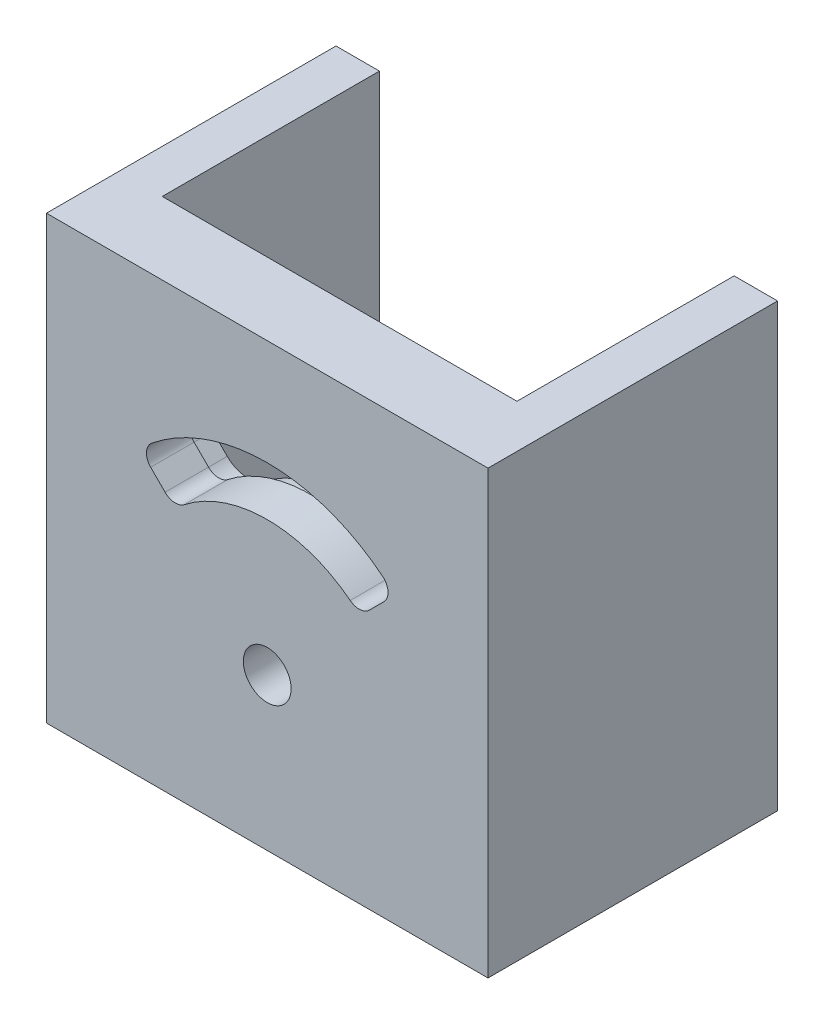
ISO-10303-21;
HEADER;
FILE_DESCRIPTION(('STEP AP214'),'2;1');
FILE_NAME('part.step','',(''),(''),'','','');
FILE_SCHEMA(('AUTOMOTIVE_DESIGN { 1 0 10303 214 1 1 1 1 }'));
ENDSEC;
DATA;
#1=APPLICATION_CONTEXT('core data for automotive mechanical design processes');
#2=APPLICATION_PROTOCOL_DEFINITION('international standard','automotive_design',2000,#1);
#3=PRODUCT_CONTEXT('',#1,'mechanical');
#4=PRODUCT('Part','Part','',(#3));
#5=PRODUCT_RELATED_PRODUCT_CATEGORY('part','',(#4));
#6=PRODUCT_DEFINITION_FORMATION('','',#4);
#7=PRODUCT_DEFINITION_CONTEXT('part definition',#1,'design');
#8=PRODUCT_DEFINITION('design','',#6,#7);
#9=PRODUCT_DEFINITION_SHAPE('','',#8);
#10=(LENGTH_UNIT() NAMED_UNIT(*) SI_UNIT(.MILLI.,.METRE.));
#11=(NAMED_UNIT(*) PLANE_ANGLE_UNIT() SI_UNIT($,.RADIAN.));
#12=(NAMED_UNIT(*) SI_UNIT($,.STERADIAN.) SOLID_ANGLE_UNIT());
#13=UNCERTAINTY_MEASURE_WITH_UNIT(LENGTH_MEASURE(1.E-05),#10,'distance_accuracy_value','');
#14=(GEOMETRIC_REPRESENTATION_CONTEXT(3) GLOBAL_UNCERTAINTY_ASSIGNED_CONTEXT((#13)) GLOBAL_UNIT_ASSIGNED_CONTEXT((#10,
#11,#12)) REPRESENTATION_CONTEXT('',''));
#15=CARTESIAN_POINT('',(0.,0.,0.));
#16=DIRECTION('',(0.,0.,1.));
#17=DIRECTION('',(1.,0.,0.));
#18=AXIS2_PLACEMENT_3D('',#15,#16,#17);
#19=CARTESIAN_POINT('',(0.,-1.09875,-5.));
#20=DIRECTION('',(0.,0.,-1.));
#21=DIRECTION('',(1.,0.,0.));
#22=AXIS2_PLACEMENT_3D('',#19,#20,#21);
#23=PLANE('',#22);
#24=CARTESIAN_POINT('',(0.,-4.75,-5.));
#25=DIRECTION('',(0.,0.,-1.));
#26=DIRECTION('',(-1.,0.,0.));
#27=AXIS2_PLACEMENT_3D('',#24,#25,#26);
#28=CIRCLE('',#27,1.65);
#29=CARTESIAN_POINT('',(-1.65,-4.75,-5.));
#30=VERTEX_POINT('',#29);
#31=EDGE_CURVE('E588',#30,#30,#28,.T.);
#32=ORIENTED_EDGE('',*,*,#31,.F.);
#33=EDGE_LOOP('',(#32));
#34=FACE_BOUND('',#33,.T.);
#35=CARTESIAN_POINT('',(0.,-4.75,-5.));
#36=DIRECTION('',(0.,0.,-1.));
#37=DIRECTION('',(-1.,0.,0.));
#38=AXIS2_PLACEMENT_3D('',#35,#36,#37);
#39=CIRCLE('',#38,8.3);
#40=CARTESIAN_POINT('',(-5.11380936571649,1.78750363450073,-5.));
#41=VERTEX_POINT('',#40);
#42=CARTESIAN_POINT('',(5.11380936571649,1.78750363450073,-5.));
#43=VERTEX_POINT('',#42);
#44=EDGE_CURVE('E480',#41,#43,#39,.T.);
#45=ORIENTED_EDGE('',*,*,#44,.T.);
#46=CARTESIAN_POINT('',(6.34605258637106,3.36280571510332,-5.));
#47=DIRECTION('',(0.,0.,1.));
#48=DIRECTION('',(-1.,0.,0.));
#49=AXIS2_PLACEMENT_3D('',#46,#47,#48);
#50=CIRCLE('',#49,2.);
#51=CARTESIAN_POINT('',(7.76026614874416,1.94859215273023,-5.));
#52=VERTEX_POINT('',#51);
#53=EDGE_CURVE('E478',#43,#52,#50,.T.);
#54=ORIENTED_EDGE('',*,*,#53,.T.);
#55=DIRECTION('',(-0.707106781186548,-0.707106781186548,0.));
#56=VECTOR('',#55,1.);
#57=CARTESIAN_POINT('',(8.25847771681434,2.44680372080041,-5.));
#58=LINE('',#57,#56);
#59=CARTESIAN_POINT('',(8.75668928488452,2.94501528887059,-5.));
#60=VERTEX_POINT('',#59);
#61=EDGE_CURVE('E475',#60,#52,#58,.T.);
#62=ORIENTED_EDGE('',*,*,#61,.F.);
#63=CARTESIAN_POINT('',(7.34247572251143,4.35922885124369,-5.));
#64=DIRECTION('',(0.,0.,1.));
#65=DIRECTION('',(-1.,0.,0.));
#66=AXIS2_PLACEMENT_3D('',#63,#64,#65);
#67=CIRCLE('',#66,2.);
#68=CARTESIAN_POINT('',(8.59759977764159,5.91636198820842,-5.));
#69=VERTEX_POINT('',#68);
#70=EDGE_CURVE('E473',#60,#69,#67,.T.);
#71=ORIENTED_EDGE('',*,*,#70,.T.);
#72=CARTESIAN_POINT('',(0.,-4.75,-5.));
#73=DIRECTION('',(0.,0.,-1.));
#74=DIRECTION('',(-1.,0.,0.));
#75=AXIS2_PLACEMENT_3D('',#72,#73,#74);
#76=CIRCLE('',#75,13.7);
#77=CARTESIAN_POINT('',(-8.59759977764158,5.91636198820842,-5.));
#78=VERTEX_POINT('',#77);
#79=EDGE_CURVE('E470',#78,#69,#76,.T.);
#80=ORIENTED_EDGE('',*,*,#79,.F.);
#81=CARTESIAN_POINT('',(-7.34247572251143,4.35922885124368,-5.));
#82=DIRECTION('',(0.,0.,1.));
#83=DIRECTION('',(-1.,0.,0.));
#84=AXIS2_PLACEMENT_3D('',#81,#82,#83);
#85=CIRCLE('',#84,2.);
#86=CARTESIAN_POINT('',(-8.75668928488452,2.94501528887058,-5.));
#87=VERTEX_POINT('',#86);
#88=EDGE_CURVE('E468',#78,#87,#85,.T.);
#89=ORIENTED_EDGE('',*,*,#88,.T.);
#90=DIRECTION('',(0.707106781186547,-0.707106781186548,0.));
#91=VECTOR('',#90,1.);
#92=CARTESIAN_POINT('',(-8.25847771681434,2.44680372080041,-5.));
#93=LINE('',#92,#91);
#94=CARTESIAN_POINT('',(-7.76026614874417,1.94859215273023,-5.));
#95=VERTEX_POINT('',#94);
#96=EDGE_CURVE('E466',#87,#95,#93,.T.);
#97=ORIENTED_EDGE('',*,*,#96,.T.);
#98=CARTESIAN_POINT('',(-6.34605258637107,3.36280571510332,-5.));
#99=DIRECTION('',(0.,0.,1.));
#100=DIRECTION('',(-1.,0.,0.));
#101=AXIS2_PLACEMENT_3D('',#98,#99,#100);
#102=CIRCLE('',#101,2.);
#103=EDGE_CURVE('E464',#95,#41,#102,.T.);
#104=ORIENTED_EDGE('',*,*,#103,.T.);
#105=EDGE_LOOP('',(#45,#54,#62,#71,#80,#89,#97,#104));
#106=FACE_BOUND('',#105,.T.);
#107=DIRECTION('',(1.,0.,0.));
#108=VECTOR('',#107,1.);
#109=CARTESIAN_POINT('',(-15.25,-15.25,-5.));
#110=LINE('',#109,#108);
#111=CARTESIAN_POINT('',(-12.25,-15.25,-5.));
#112=VERTEX_POINT('',#111);
#113=CARTESIAN_POINT('',(12.25,-15.25,-5.));
#114=VERTEX_POINT('',#113);
#115=EDGE_CURVE('E54',#112,#114,#110,.T.);
#116=ORIENTED_EDGE('',*,*,#115,.F.);
#117=DIRECTION('',(0.,-1.,0.));
#118=VECTOR('',#117,1.);
#119=CARTESIAN_POINT('',(-12.25,-15.25,-5.));
#120=LINE('',#119,#118);
#121=CARTESIAN_POINT('',(-12.25,15.25,-5.));
#122=VERTEX_POINT('',#121);
#123=EDGE_CURVE('E232',#122,#112,#120,.T.);
#124=ORIENTED_EDGE('',*,*,#123,.F.);
#125=DIRECTION('',(-1.,0.,0.));
#126=VECTOR('',#125,1.);
#127=CARTESIAN_POINT('',(15.25,15.25,-5.));
#128=LINE('',#127,#126);
#129=CARTESIAN_POINT('',(12.25,15.25,-5.));
#130=VERTEX_POINT('',#129);
#131=EDGE_CURVE('E482',#130,#122,#128,.T.);
#132=ORIENTED_EDGE('',*,*,#131,.F.);
#133=DIRECTION('',(0.,1.,0.));
#134=VECTOR('',#133,1.);
#135=CARTESIAN_POINT('',(12.25,-15.25,-5.));
#136=LINE('',#135,#134);
#137=EDGE_CURVE('E237',#114,#130,#136,.T.);
#138=ORIENTED_EDGE('',*,*,#137,.F.);
#139=EDGE_LOOP('',(#116,#124,#132,#138));
#140=FACE_BOUND('',#139,.T.);
#141=ADVANCED_FACE('F37',(#34,#106,#140),#23,.T.);
#142=CARTESIAN_POINT('',(0.,-4.75,-5.));
#143=DIRECTION('',(0.,0.,1.));
#144=DIRECTION('',(1.,0.,0.));
#145=AXIS2_PLACEMENT_3D('',#142,#143,#144);
#146=CYLINDRICAL_SURFACE('',#145,12.7);
#147=DIRECTION('',(0.,0.,1.));
#148=VECTOR('',#147,1.);
#149=CARTESIAN_POINT('',(-7.9700377500765,5.13779541972605,-5.));
#150=LINE('',#149,#148);
#151=CARTESIAN_POINT('',(-7.97003775007651,5.13779541972605,0.));
#152=VERTEX_POINT('',#151);
#153=CARTESIAN_POINT('',(-7.97003775007651,5.13779541972605,-3.));
#154=VERTEX_POINT('',#153);
#155=EDGE_CURVE('E11',#152,#154,#150,.F.);
#156=ORIENTED_EDGE('',*,*,#155,.T.);
#157=CARTESIAN_POINT('',(0.,-4.75,-3.));
#158=DIRECTION('',(0.,0.,-1.));
#159=DIRECTION('',(-1.,0.,0.));
#160=AXIS2_PLACEMENT_3D('',#157,#158,#159);
#161=CIRCLE('',#160,12.7);
#162=CARTESIAN_POINT('',(7.9700377500765,5.13779541972605,-3.));
#163=VERTEX_POINT('',#162);
#164=EDGE_CURVE('E46',#154,#163,#161,.T.);
#165=ORIENTED_EDGE('',*,*,#164,.T.);
#166=DIRECTION('',(0.,0.,1.));
#167=VECTOR('',#166,1.);
#168=CARTESIAN_POINT('',(7.97003775007651,5.13779541972605,-5.));
#169=LINE('',#168,#167);
#170=CARTESIAN_POINT('',(7.9700377500765,5.13779541972605,0.));
#171=VERTEX_POINT('',#170);
#172=EDGE_CURVE('E564',#163,#171,#169,.T.);
#173=ORIENTED_EDGE('',*,*,#172,.T.);
#174=CARTESIAN_POINT('',(0.,-4.75,0.));
#175=DIRECTION('',(0.,0.,-1.));
#176=DIRECTION('',(-1.,0.,0.));
#177=AXIS2_PLACEMENT_3D('',#174,#175,#176);
#178=CIRCLE('',#177,12.7);
#179=EDGE_CURVE('E553',#152,#171,#178,.T.);
#180=ORIENTED_EDGE('',*,*,#179,.F.);
#181=EDGE_LOOP('',(#156,#165,#173,#180));
#182=FACE_BOUND('',#181,.T.);
#183=ADVANCED_FACE('F39',(#182),#146,.F.);
#184=CARTESIAN_POINT('',(-8.18900691705113,3.79154648341029,-5.));
#185=DIRECTION('',(-0.707106781186548,-0.707106781186547,0.));
#186=DIRECTION('',(0.707106781186547,-0.707106781186548,0.));
#187=AXIS2_PLACEMENT_3D('',#184,#185,#186);
#188=PLANE('',#187);
#189=DIRECTION('',(0.707106781186547,-0.707106781186548,0.));
#190=VECTOR('',#189,1.);
#191=CARTESIAN_POINT('',(-8.18900691705113,3.79154648341029,-3.));
#192=LINE('',#191,#190);
#193=CARTESIAN_POINT('',(-8.04958250369797,3.65212207005713,-3.));
#194=VERTEX_POINT('',#193);
#195=CARTESIAN_POINT('',(-7.05315936755762,2.65569893391677,-3.));
#196=VERTEX_POINT('',#195);
#197=EDGE_CURVE('E545',#194,#196,#192,.T.);
#198=ORIENTED_EDGE('',*,*,#197,.F.);
#199=DIRECTION('',(0.,0.,1.));
#200=VECTOR('',#199,1.);
#201=CARTESIAN_POINT('',(-8.04958250369797,3.65212207005713,-5.));
#202=LINE('',#201,#200);
#203=CARTESIAN_POINT('',(-8.04958250369797,3.65212207005713,0.));
#204=VERTEX_POINT('',#203);
#205=EDGE_CURVE('E547',#194,#204,#202,.T.);
#206=ORIENTED_EDGE('',*,*,#205,.T.);
#207=DIRECTION('',(0.707106781186547,-0.707106781186548,0.));
#208=VECTOR('',#207,1.);
#209=CARTESIAN_POINT('',(-8.18900691705113,3.79154648341029,0.));
#210=LINE('',#209,#208);
#211=CARTESIAN_POINT('',(-7.05315936755762,2.65569893391677,0.));
#212=VERTEX_POINT('',#211);
#213=EDGE_CURVE('E558',#204,#212,#210,.T.);
#214=ORIENTED_EDGE('',*,*,#213,.T.);
#215=DIRECTION('',(0.,0.,-1.));
#216=VECTOR('',#215,1.);
#217=CARTESIAN_POINT('',(-7.05315936755762,2.65569893391677,-5.));
#218=LINE('',#217,#216);
#219=EDGE_CURVE('E550',#212,#196,#218,.T.);
#220=ORIENTED_EDGE('',*,*,#219,.T.);
#221=EDGE_LOOP('',(#198,#206,#214,#220));
#222=FACE_BOUND('',#221,.T.);
#223=ADVANCED_FACE('F526',(#222),#188,.F.);
#224=CARTESIAN_POINT('',(0.,-4.75,-5.));
#225=DIRECTION('',(0.,0.,1.));
#226=DIRECTION('',(1.,0.,0.));
#227=AXIS2_PLACEMENT_3D('',#224,#225,#226);
#228=CYLINDRICAL_SURFACE('',#227,9.3);
#229=CARTESIAN_POINT('',(0.,-4.75,-3.));
#230=DIRECTION('',(0.,0.,-1.));
#231=DIRECTION('',(-1.,0.,0.));
#232=AXIS2_PLACEMENT_3D('',#229,#230,#231);
#233=CIRCLE('',#232,9.3);
#234=CARTESIAN_POINT('',(-5.72993097604378,2.57515467480203,-3.));
#235=VERTEX_POINT('',#234);
#236=CARTESIAN_POINT('',(5.72993097604378,2.57515467480203,-3.));
#237=VERTEX_POINT('',#236);
#238=EDGE_CURVE('E571',#235,#237,#233,.T.);
#239=ORIENTED_EDGE('',*,*,#238,.F.);
#240=DIRECTION('',(0.,0.,1.));
#241=VECTOR('',#240,1.);
#242=CARTESIAN_POINT('',(-5.72993097604378,2.57515467480203,-5.));
#243=LINE('',#242,#241);
#244=CARTESIAN_POINT('',(-5.72993097604378,2.57515467480203,0.));
#245=VERTEX_POINT('',#244);
#246=EDGE_CURVE('E574',#235,#245,#243,.T.);
#247=ORIENTED_EDGE('',*,*,#246,.T.);
#248=CARTESIAN_POINT('',(0.,-4.75,0.));
#249=DIRECTION('',(0.,0.,-1.));
#250=DIRECTION('',(-1.,0.,0.));
#251=AXIS2_PLACEMENT_3D('',#248,#249,#250);
#252=CIRCLE('',#251,9.3);
#253=CARTESIAN_POINT('',(5.72993097604378,2.57515467480203,0.));
#254=VERTEX_POINT('',#253);
#255=EDGE_CURVE('E576',#245,#254,#252,.T.);
#256=ORIENTED_EDGE('',*,*,#255,.T.);
#257=DIRECTION('',(0.,0.,1.));
#258=VECTOR('',#257,1.);
#259=CARTESIAN_POINT('',(5.72993097604378,2.57515467480203,-5.));
#260=LINE('',#259,#258);
#261=EDGE_CURVE('E578',#254,#237,#260,.F.);
#262=ORIENTED_EDGE('',*,*,#261,.T.);
#263=EDGE_LOOP('',(#239,#247,#256,#262));
#264=FACE_BOUND('',#263,.T.);
#265=ADVANCED_FACE('F536',(#264),#228,.T.);
#266=CARTESIAN_POINT('',(8.18900691705112,3.79154648341028,-5.));
#267=DIRECTION('',(-0.707106781186547,0.707106781186548,0.));
#268=DIRECTION('',(-0.707106781186548,-0.707106781186547,0.));
#269=AXIS2_PLACEMENT_3D('',#266,#267,#268);
#270=PLANE('',#269);
#271=DIRECTION('',(0.,0.,-1.));
#272=VECTOR('',#271,1.);
#273=CARTESIAN_POINT('',(8.04958250369798,3.65212207005714,-5.));
#274=LINE('',#273,#272);
#275=CARTESIAN_POINT('',(8.04958250369798,3.65212207005714,0.));
#276=VERTEX_POINT('',#275);
#277=CARTESIAN_POINT('',(8.04958250369798,3.65212207005714,-3.));
#278=VERTEX_POINT('',#277);
#279=EDGE_CURVE('E580',#276,#278,#274,.T.);
#280=ORIENTED_EDGE('',*,*,#279,.T.);
#281=DIRECTION('',(-0.707106781186548,-0.707106781186547,0.));
#282=VECTOR('',#281,1.);
#283=CARTESIAN_POINT('',(8.18900691705112,3.79154648341028,-3.));
#284=LINE('',#283,#282);
#285=CARTESIAN_POINT('',(7.05315936755761,2.65569893391677,-3.));
#286=VERTEX_POINT('',#285);
#287=EDGE_CURVE('E582',#278,#286,#284,.T.);
#288=ORIENTED_EDGE('',*,*,#287,.T.);
#289=DIRECTION('',(0.,0.,1.));
#290=VECTOR('',#289,1.);
#291=CARTESIAN_POINT('',(7.05315936755761,2.65569893391677,-5.));
#292=LINE('',#291,#290);
#293=CARTESIAN_POINT('',(7.05315936755761,2.65569893391677,0.));
#294=VERTEX_POINT('',#293);
#295=EDGE_CURVE('E584',#286,#294,#292,.T.);
#296=ORIENTED_EDGE('',*,*,#295,.T.);
#297=DIRECTION('',(-0.707106781186548,-0.707106781186547,0.));
#298=VECTOR('',#297,1.);
#299=CARTESIAN_POINT('',(8.18900691705112,3.79154648341028,0.));
#300=LINE('',#299,#298);
#301=EDGE_CURVE('E586',#276,#294,#300,.T.);
#302=ORIENTED_EDGE('',*,*,#301,.F.);
#303=EDGE_LOOP('',(#280,#288,#296,#302));
#304=FACE_BOUND('',#303,.T.);
#305=ADVANCED_FACE('F533',(#304),#270,.T.);
#306=CARTESIAN_POINT('',(-7.34247572251142,4.35922885124368,-5.));
#307=DIRECTION('',(0.,0.,1.));
#308=DIRECTION('',(1.,0.,0.));
#309=AXIS2_PLACEMENT_3D('',#306,#307,#308);
#310=CYLINDRICAL_SURFACE('',#309,1.);
#311=CARTESIAN_POINT('',(-7.34247572251142,4.35922885124368,-3.));
#312=DIRECTION('',(0.,0.,-1.));
#313=DIRECTION('',(-1.,0.,0.));
#314=AXIS2_PLACEMENT_3D('',#311,#312,#313);
#315=CIRCLE('',#314,1.);
#316=EDGE_CURVE('E461',#154,#194,#315,.F.);
#317=ORIENTED_EDGE('',*,*,#316,.F.);
#318=ORIENTED_EDGE('',*,*,#155,.F.);
#319=CARTESIAN_POINT('',(-7.34247572251142,4.35922885124368,0.));
#320=DIRECTION('',(0.,0.,-1.));
#321=DIRECTION('',(-1.,0.,0.));
#322=AXIS2_PLACEMENT_3D('',#319,#320,#321);
#323=CIRCLE('',#322,1.);
#324=EDGE_CURVE('E458',#204,#152,#323,.T.);
#325=ORIENTED_EDGE('',*,*,#324,.F.);
#326=ORIENTED_EDGE('',*,*,#205,.F.);
#327=EDGE_LOOP('',(#317,#318,#325,#326));
#328=FACE_BOUND('',#327,.T.);
#329=ADVANCED_FACE('F531',(#328),#310,.F.);
#330=CARTESIAN_POINT('',(7.34247572251143,4.35922885124368,-5.));
#331=DIRECTION('',(0.,0.,1.));
#332=DIRECTION('',(1.,0.,0.));
#333=AXIS2_PLACEMENT_3D('',#330,#331,#332);
#334=CYLINDRICAL_SURFACE('',#333,1.);
#335=CARTESIAN_POINT('',(7.34247572251143,4.35922885124368,-3.));
#336=DIRECTION('',(0.,0.,-1.));
#337=DIRECTION('',(-1.,0.,0.));
#338=AXIS2_PLACEMENT_3D('',#335,#336,#337);
#339=CIRCLE('',#338,1.);
#340=EDGE_CURVE('E455',#278,#163,#339,.F.);
#341=ORIENTED_EDGE('',*,*,#340,.F.);
#342=ORIENTED_EDGE('',*,*,#279,.F.);
#343=CARTESIAN_POINT('',(7.34247572251143,4.35922885124368,0.));
#344=DIRECTION('',(0.,0.,-1.));
#345=DIRECTION('',(-1.,0.,0.));
#346=AXIS2_PLACEMENT_3D('',#343,#344,#345);
#347=CIRCLE('',#346,1.);
#348=EDGE_CURVE('E452',#171,#276,#347,.T.);
#349=ORIENTED_EDGE('',*,*,#348,.F.);
#350=ORIENTED_EDGE('',*,*,#172,.F.);
#351=EDGE_LOOP('',(#341,#342,#349,#350));
#352=FACE_BOUND('',#351,.T.);
#353=ADVANCED_FACE('F595',(#352),#334,.F.);
#354=CARTESIAN_POINT('',(6.34605258637106,3.36280571510332,-5.));
#355=DIRECTION('',(0.,0.,1.));
#356=DIRECTION('',(1.,0.,0.));
#357=AXIS2_PLACEMENT_3D('',#354,#355,#356);
#358=CYLINDRICAL_SURFACE('',#357,1.);
#359=CARTESIAN_POINT('',(6.34605258637106,3.36280571510332,-3.));
#360=DIRECTION('',(0.,0.,-1.));
#361=DIRECTION('',(-1.,0.,0.));
#362=AXIS2_PLACEMENT_3D('',#359,#360,#361);
#363=CIRCLE('',#362,1.);
#364=EDGE_CURVE('E449',#237,#286,#363,.F.);
#365=ORIENTED_EDGE('',*,*,#364,.F.);
#366=ORIENTED_EDGE('',*,*,#261,.F.);
#367=CARTESIAN_POINT('',(6.34605258637106,3.36280571510332,0.));
#368=DIRECTION('',(0.,0.,-1.));
#369=DIRECTION('',(-1.,0.,0.));
#370=AXIS2_PLACEMENT_3D('',#367,#368,#369);
#371=CIRCLE('',#370,1.);
#372=EDGE_CURVE('E446',#294,#254,#371,.T.);
#373=ORIENTED_EDGE('',*,*,#372,.F.);
#374=ORIENTED_EDGE('',*,*,#295,.F.);
#375=EDGE_LOOP('',(#365,#366,#373,#374));
#376=FACE_BOUND('',#375,.T.);
#377=ADVANCED_FACE('F598',(#376),#358,.F.);
#378=CARTESIAN_POINT('',(-6.34605258637107,3.36280571510332,-5.));
#379=DIRECTION('',(0.,0.,1.));
#380=DIRECTION('',(1.,0.,0.));
#381=AXIS2_PLACEMENT_3D('',#378,#379,#380);
#382=CYLINDRICAL_SURFACE('',#381,1.);
#383=CARTESIAN_POINT('',(-6.34605258637107,3.36280571510332,-3.));
#384=DIRECTION('',(0.,0.,-1.));
#385=DIRECTION('',(-1.,0.,0.));
#386=AXIS2_PLACEMENT_3D('',#383,#384,#385);
#387=CIRCLE('',#386,1.);
#388=EDGE_CURVE('E443',#196,#235,#387,.F.);
#389=ORIENTED_EDGE('',*,*,#388,.F.);
#390=ORIENTED_EDGE('',*,*,#219,.F.);
#391=CARTESIAN_POINT('',(-6.34605258637107,3.36280571510332,0.));
#392=DIRECTION('',(0.,0.,-1.));
#393=DIRECTION('',(-1.,0.,0.));
#394=AXIS2_PLACEMENT_3D('',#391,#392,#393);
#395=CIRCLE('',#394,1.);
#396=EDGE_CURVE('E438',#245,#212,#395,.T.);
#397=ORIENTED_EDGE('',*,*,#396,.F.);
#398=ORIENTED_EDGE('',*,*,#246,.F.);
#399=EDGE_LOOP('',(#389,#390,#397,#398));
#400=FACE_BOUND('',#399,.T.);
#401=ADVANCED_FACE('F603',(#400),#382,.F.);
#402=CARTESIAN_POINT('',(15.25,-15.25,-5.));
#403=DIRECTION('',(1.,0.,0.));
#404=DIRECTION('',(0.,1.,0.));
#405=AXIS2_PLACEMENT_3D('',#402,#403,#404);
#406=PLANE('',#405);
#407=DIRECTION('',(0.,1.,0.));
#408=VECTOR('',#407,1.);
#409=CARTESIAN_POINT('',(15.25,-15.25,0.));
#410=LINE('',#409,#408);
#411=CARTESIAN_POINT('',(15.25,-15.25,0.));
#412=VERTEX_POINT('',#411);
#413=CARTESIAN_POINT('',(15.25,15.25,0.));
#414=VERTEX_POINT('',#413);
#415=EDGE_CURVE('E435',#412,#414,#410,.T.);
#416=ORIENTED_EDGE('',*,*,#415,.F.);
#417=CARTESIAN_POINT('',(15.25,-15.25,-5.));
#418=DIRECTION('',(0.,0.,1.));
#419=VECTOR('',#418,1.);
#420=LINE('',#417,#419);
#421=CARTESIAN_POINT('',(15.25,-15.25,-5.));
#422=VERTEX_POINT('',#421);
#423=EDGE_CURVE('E433',#422,#412,#420,.T.);
#424=ORIENTED_EDGE('',*,*,#423,.F.);
#425=DIRECTION('',(0.,0.,1.));
#426=VECTOR('',#425,1.);
#427=CARTESIAN_POINT('',(15.25,-15.25,-20.));
#428=LINE('',#427,#426);
#429=CARTESIAN_POINT('',(15.25,-15.25,-20.));
#430=VERTEX_POINT('',#429);
#431=EDGE_CURVE('E270',#430,#422,#428,.T.);
#432=ORIENTED_EDGE('',*,*,#431,.F.);
#433=DIRECTION('',(0.,1.,0.));
#434=VECTOR('',#433,1.);
#435=CARTESIAN_POINT('',(15.25,-15.25,-20.));
#436=LINE('',#435,#434);
#437=CARTESIAN_POINT('',(15.25,15.25,-20.));
#438=VERTEX_POINT('',#437);
#439=EDGE_CURVE('E263',#430,#438,#436,.T.);
#440=ORIENTED_EDGE('',*,*,#439,.T.);
#441=DIRECTION('',(0.,0.,1.));
#442=VECTOR('',#441,1.);
#443=CARTESIAN_POINT('',(15.25,15.25,-20.));
#444=LINE('',#443,#442);
#445=CARTESIAN_POINT('',(15.25,15.25,-5.));
#446=VERTEX_POINT('',#445);
#447=EDGE_CURVE('E277',#438,#446,#444,.T.);
#448=ORIENTED_EDGE('',*,*,#447,.T.);
#449=CARTESIAN_POINT('',(15.25,15.25,-5.));
#450=DIRECTION('',(0.,0.,1.));
#451=VECTOR('',#450,1.);
#452=LINE('',#449,#451);
#453=EDGE_CURVE('E353',#446,#414,#452,.T.);
#454=ORIENTED_EDGE('',*,*,#453,.T.);
#455=EDGE_LOOP('',(#416,#424,#432,#440,#448,#454));
#456=FACE_BOUND('',#455,.T.);
#457=ADVANCED_FACE('F396',(#456),#406,.T.);
#458=CARTESIAN_POINT('',(-15.25,-15.25,-5.));
#459=DIRECTION('',(0.,-1.,0.));
#460=DIRECTION('',(1.,0.,0.));
#461=AXIS2_PLACEMENT_3D('',#458,#459,#460);
#462=PLANE('',#461);
#463=DIRECTION('',(1.,0.,0.));
#464=VECTOR('',#463,1.);
#465=CARTESIAN_POINT('',(-15.25,-15.25,0.));
#466=LINE('',#465,#464);
#467=CARTESIAN_POINT('',(-15.25,-15.25,0.));
#468=VERTEX_POINT('',#467);
#469=EDGE_CURVE('E409',#468,#412,#466,.T.);
#470=ORIENTED_EDGE('',*,*,#469,.F.);
#471=CARTESIAN_POINT('',(-15.25,-15.25,-5.));
#472=DIRECTION('',(0.,0.,1.));
#473=VECTOR('',#472,1.);
#474=LINE('',#471,#473);
#475=CARTESIAN_POINT('',(-15.25,-15.25,-5.));
#476=VERTEX_POINT('',#475);
#477=EDGE_CURVE('E368',#476,#468,#474,.T.);
#478=ORIENTED_EDGE('',*,*,#477,.F.);
#479=DIRECTION('',(0.,0.,1.));
#480=VECTOR('',#479,1.);
#481=CARTESIAN_POINT('',(-15.25,-15.25,-20.));
#482=LINE('',#481,#480);
#483=CARTESIAN_POINT('',(-15.25,-15.25,-20.));
#484=VERTEX_POINT('',#483);
#485=EDGE_CURVE('E249',#484,#476,#482,.T.);
#486=ORIENTED_EDGE('',*,*,#485,.F.);
#487=DIRECTION('',(-1.,0.,0.));
#488=VECTOR('',#487,1.);
#489=CARTESIAN_POINT('',(-15.25,-15.25,-20.));
#490=LINE('',#489,#488);
#491=CARTESIAN_POINT('',(-12.25,-15.25,-20.));
#492=VERTEX_POINT('',#491);
#493=EDGE_CURVE('E229',#492,#484,#490,.T.);
#494=ORIENTED_EDGE('',*,*,#493,.F.);
#495=DIRECTION('',(0.,0.,1.));
#496=VECTOR('',#495,1.);
#497=CARTESIAN_POINT('',(-12.25,-15.25,-20.));
#498=LINE('',#497,#496);
#499=EDGE_CURVE('E242',#492,#112,#498,.T.);
#500=ORIENTED_EDGE('',*,*,#499,.T.);
#501=ORIENTED_EDGE('',*,*,#115,.T.);
#502=DIRECTION('',(0.,0.,1.));
#503=VECTOR('',#502,1.);
#504=CARTESIAN_POINT('',(12.25,-15.25,-20.));
#505=LINE('',#504,#503);
#506=CARTESIAN_POINT('',(12.25,-15.25,-20.));
#507=VERTEX_POINT('',#506);
#508=EDGE_CURVE('E267',#507,#114,#505,.T.);
#509=ORIENTED_EDGE('',*,*,#508,.F.);
#510=DIRECTION('',(-1.,0.,0.));
#511=VECTOR('',#510,1.);
#512=CARTESIAN_POINT('',(15.25,-15.25,-20.));
#513=LINE('',#512,#511);
#514=EDGE_CURVE('E261',#430,#507,#513,.T.);
#515=ORIENTED_EDGE('',*,*,#514,.F.);
#516=ORIENTED_EDGE('',*,*,#431,.T.);
#517=ORIENTED_EDGE('',*,*,#423,.T.);
#518=EDGE_LOOP('',(#470,#478,#486,#494,#500,#501,#509,#515,#516,#517));
#519=FACE_BOUND('',#518,.T.);
#520=ADVANCED_FACE('F387',(#519),#462,.T.);
#521=CARTESIAN_POINT('',(-15.25,15.25,-5.));
#522=DIRECTION('',(-1.,0.,0.));
#523=DIRECTION('',(0.,-1.,0.));
#524=AXIS2_PLACEMENT_3D('',#521,#522,#523);
#525=PLANE('',#524);
#526=DIRECTION('',(0.,-1.,0.));
#527=VECTOR('',#526,1.);
#528=CARTESIAN_POINT('',(-15.25,15.25,0.));
#529=LINE('',#528,#527);
#530=CARTESIAN_POINT('',(-15.25,15.25,0.));
#531=VERTEX_POINT('',#530);
#532=EDGE_CURVE('E378',#531,#468,#529,.T.);
#533=ORIENTED_EDGE('',*,*,#532,.F.);
#534=CARTESIAN_POINT('',(-15.25,15.25,-5.));
#535=DIRECTION('',(0.,0.,1.));
#536=VECTOR('',#535,1.);
#537=LINE('',#534,#536);
#538=CARTESIAN_POINT('',(-15.25,15.25,-5.));
#539=VERTEX_POINT('',#538);
#540=EDGE_CURVE('E235',#539,#531,#537,.T.);
#541=ORIENTED_EDGE('',*,*,#540,.F.);
#542=DIRECTION('',(0.,0.,1.));
#543=VECTOR('',#542,1.);
#544=CARTESIAN_POINT('',(-15.25,15.25,-20.));
#545=LINE('',#544,#543);
#546=CARTESIAN_POINT('',(-15.25,15.25,-20.));
#547=VERTEX_POINT('',#546);
#548=EDGE_CURVE('E217',#547,#539,#545,.T.);
#549=ORIENTED_EDGE('',*,*,#548,.F.);
#550=DIRECTION('',(0.,1.,0.));
#551=VECTOR('',#550,1.);
#552=CARTESIAN_POINT('',(-15.25,-15.25,-20.));
#553=LINE('',#552,#551);
#554=EDGE_CURVE('E224',#484,#547,#553,.T.);
#555=ORIENTED_EDGE('',*,*,#554,.F.);
#556=ORIENTED_EDGE('',*,*,#485,.T.);
#557=ORIENTED_EDGE('',*,*,#477,.T.);
#558=EDGE_LOOP('',(#533,#541,#549,#555,#556,#557));
#559=FACE_BOUND('',#558,.T.);
#560=ADVANCED_FACE('F234',(#559),#525,.T.);
#561=CARTESIAN_POINT('',(15.25,15.25,-5.));
#562=DIRECTION('',(0.,1.,0.));
#563=DIRECTION('',(-1.,0.,0.));
#564=AXIS2_PLACEMENT_3D('',#561,#562,#563);
#565=PLANE('',#564);
#566=DIRECTION('',(-1.,0.,0.));
#567=VECTOR('',#566,1.);
#568=CARTESIAN_POINT('',(15.25,15.25,0.));
#569=LINE('',#568,#567);
#570=EDGE_CURVE('E324',#414,#531,#569,.T.);
#571=ORIENTED_EDGE('',*,*,#570,.F.);
#572=ORIENTED_EDGE('',*,*,#453,.F.);
#573=ORIENTED_EDGE('',*,*,#447,.F.);
#574=DIRECTION('',(-1.,0.,0.));
#575=VECTOR('',#574,1.);
#576=CARTESIAN_POINT('',(15.25,15.25,-20.));
#577=LINE('',#576,#575);
#578=CARTESIAN_POINT('',(12.25,15.25,-20.));
#579=VERTEX_POINT('',#578);
#580=EDGE_CURVE('E240',#438,#579,#577,.T.);
#581=ORIENTED_EDGE('',*,*,#580,.T.);
#582=DIRECTION('',(0.,0.,1.));
#583=VECTOR('',#582,1.);
#584=CARTESIAN_POINT('',(12.25,15.25,-20.));
#585=LINE('',#584,#583);
#586=EDGE_CURVE('E265',#579,#130,#585,.T.);
#587=ORIENTED_EDGE('',*,*,#586,.T.);
#588=ORIENTED_EDGE('',*,*,#131,.T.);
#589=DIRECTION('',(0.,0.,1.));
#590=VECTOR('',#589,1.);
#591=CARTESIAN_POINT('',(-12.25,15.25,-20.));
#592=LINE('',#591,#590);
#593=CARTESIAN_POINT('',(-12.25,15.25,-20.));
#594=VERTEX_POINT('',#593);
#595=EDGE_CURVE('E220',#594,#122,#592,.T.);
#596=ORIENTED_EDGE('',*,*,#595,.F.);
#597=DIRECTION('',(1.,0.,0.));
#598=VECTOR('',#597,1.);
#599=CARTESIAN_POINT('',(-15.25,15.25,-20.));
#600=LINE('',#599,#598);
#601=EDGE_CURVE('E211',#547,#594,#600,.T.);
#602=ORIENTED_EDGE('',*,*,#601,.F.);
#603=ORIENTED_EDGE('',*,*,#548,.T.);
#604=ORIENTED_EDGE('',*,*,#540,.T.);
#605=EDGE_LOOP('',(#571,#572,#573,#581,#587,#588,#596,#602,#603,#604));
#606=FACE_BOUND('',#605,.T.);
#607=ADVANCED_FACE('F214',(#606),#565,.T.);
#608=CARTESIAN_POINT('',(0.,-4.75,-5.));
#609=DIRECTION('',(0.,0.,1.));
#610=DIRECTION('',(1.,0.,0.));
#611=AXIS2_PLACEMENT_3D('',#608,#609,#610);
#612=CYLINDRICAL_SURFACE('',#611,1.65);
#613=ORIENTED_EDGE('',*,*,#31,.T.);
#614=EDGE_LOOP('',(#613));
#615=FACE_BOUND('',#614,.T.);
#616=CARTESIAN_POINT('',(0.,-4.75,0.));
#617=DIRECTION('',(0.,0.,-1.));
#618=DIRECTION('',(-1.,0.,0.));
#619=AXIS2_PLACEMENT_3D('',#616,#617,#618);
#620=CIRCLE('',#619,1.65);
#621=CARTESIAN_POINT('',(-1.65,-4.75,0.));
#622=VERTEX_POINT('',#621);
#623=EDGE_CURVE('E321',#622,#622,#620,.T.);
#624=ORIENTED_EDGE('',*,*,#623,.F.);
#625=EDGE_LOOP('',(#624));
#626=FACE_BOUND('',#625,.T.);
#627=ADVANCED_FACE('F339',(#615,#626),#612,.F.);
#628=CARTESIAN_POINT('',(0.,-1.09875,0.));
#629=DIRECTION('',(0.,0.,-1.));
#630=DIRECTION('',(1.,0.,0.));
#631=AXIS2_PLACEMENT_3D('',#628,#629,#630);
#632=PLANE('',#631);
#633=ORIENTED_EDGE('',*,*,#213,.F.);
#634=ORIENTED_EDGE('',*,*,#324,.T.);
#635=ORIENTED_EDGE('',*,*,#179,.T.);
#636=ORIENTED_EDGE('',*,*,#348,.T.);
#637=ORIENTED_EDGE('',*,*,#301,.T.);
#638=ORIENTED_EDGE('',*,*,#372,.T.);
#639=ORIENTED_EDGE('',*,*,#255,.F.);
#640=ORIENTED_EDGE('',*,*,#396,.T.);
#641=EDGE_LOOP('',(#633,#634,#635,#636,#637,#638,#639,#640));
#642=FACE_BOUND('',#641,.T.);
#643=ORIENTED_EDGE('',*,*,#415,.T.);
#644=ORIENTED_EDGE('',*,*,#570,.T.);
#645=ORIENTED_EDGE('',*,*,#532,.T.);
#646=ORIENTED_EDGE('',*,*,#469,.T.);
#647=EDGE_LOOP('',(#643,#644,#645,#646));
#648=FACE_BOUND('',#647,.T.);
#649=ORIENTED_EDGE('',*,*,#623,.T.);
#650=EDGE_LOOP('',(#649));
#651=FACE_BOUND('',#650,.T.);
#652=ADVANCED_FACE('F508',(#642,#648,#651),#632,.F.);
#653=CARTESIAN_POINT('',(6.34605258637106,3.36280571510332,-3.));
#654=DIRECTION('',(0.,0.,-1.));
#655=DIRECTION('',(-1.,0.,0.));
#656=AXIS2_PLACEMENT_3D('',#653,#654,#655);
#657=CYLINDRICAL_SURFACE('',#656,2.);
#658=ORIENTED_EDGE('',*,*,#53,.F.);
#659=DIRECTION('',(0.,0.,-1.));
#660=VECTOR('',#659,1.);
#661=CARTESIAN_POINT('',(5.11380936571649,1.78750363450073,-3.));
#662=LINE('',#661,#660);
#663=CARTESIAN_POINT('',(5.11380936571649,1.78750363450073,-3.));
#664=VERTEX_POINT('',#663);
#665=EDGE_CURVE('E318',#664,#43,#662,.T.);
#666=ORIENTED_EDGE('',*,*,#665,.F.);
#667=CARTESIAN_POINT('',(6.34605258637106,3.36280571510332,-3.));
#668=DIRECTION('',(0.,0.,1.));
#669=DIRECTION('',(-1.,0.,0.));
#670=AXIS2_PLACEMENT_3D('',#667,#668,#669);
#671=CIRCLE('',#670,2.);
#672=CARTESIAN_POINT('',(7.76026614874416,1.94859215273023,-3.));
#673=VERTEX_POINT('',#672);
#674=EDGE_CURVE('E316',#664,#673,#671,.T.);
#675=ORIENTED_EDGE('',*,*,#674,.T.);
#676=DIRECTION('',(0.,0.,-1.));
#677=VECTOR('',#676,1.);
#678=CARTESIAN_POINT('',(7.76026614874416,1.94859215273023,-3.));
#679=LINE('',#678,#677);
#680=EDGE_CURVE('E313',#673,#52,#679,.T.);
#681=ORIENTED_EDGE('',*,*,#680,.T.);
#682=EDGE_LOOP('',(#658,#666,#675,#681));
#683=FACE_BOUND('',#682,.T.);
#684=ADVANCED_FACE('F511',(#683),#657,.F.);
#685=CARTESIAN_POINT('',(0.,-4.75,-3.));
#686=DIRECTION('',(0.,0.,-1.));
#687=DIRECTION('',(-1.,0.,0.));
#688=AXIS2_PLACEMENT_3D('',#685,#686,#687);
#689=CYLINDRICAL_SURFACE('',#688,8.3);
#690=ORIENTED_EDGE('',*,*,#44,.F.);
#691=DIRECTION('',(0.,0.,-1.));
#692=VECTOR('',#691,1.);
#693=CARTESIAN_POINT('',(-5.11380936571649,1.78750363450073,-3.));
#694=LINE('',#693,#692);
#695=CARTESIAN_POINT('',(-5.11380936571649,1.78750363450073,-3.));
#696=VERTEX_POINT('',#695);
#697=EDGE_CURVE('E310',#696,#41,#694,.T.);
#698=ORIENTED_EDGE('',*,*,#697,.F.);
#699=CARTESIAN_POINT('',(0.,-4.75,-3.));
#700=DIRECTION('',(0.,0.,-1.));
#701=DIRECTION('',(-1.,0.,0.));
#702=AXIS2_PLACEMENT_3D('',#699,#700,#701);
#703=CIRCLE('',#702,8.3);
#704=EDGE_CURVE('E307',#696,#664,#703,.T.);
#705=ORIENTED_EDGE('',*,*,#704,.T.);
#706=ORIENTED_EDGE('',*,*,#665,.T.);
#707=EDGE_LOOP('',(#690,#698,#705,#706));
#708=FACE_BOUND('',#707,.T.);
#709=ADVANCED_FACE('F713',(#708),#689,.T.);
#710=CARTESIAN_POINT('',(-6.34605258637107,3.36280571510332,-3.));
#711=DIRECTION('',(0.,0.,-1.));
#712=DIRECTION('',(-1.,0.,0.));
#713=AXIS2_PLACEMENT_3D('',#710,#711,#712);
#714=CYLINDRICAL_SURFACE('',#713,2.);
#715=ORIENTED_EDGE('',*,*,#103,.F.);
#716=DIRECTION('',(0.,0.,-1.));
#717=VECTOR('',#716,1.);
#718=CARTESIAN_POINT('',(-7.76026614874417,1.94859215273023,-3.));
#719=LINE('',#718,#717);
#720=CARTESIAN_POINT('',(-7.76026614874417,1.94859215273023,-3.));
#721=VERTEX_POINT('',#720);
#722=EDGE_CURVE('E304',#721,#95,#719,.T.);
#723=ORIENTED_EDGE('',*,*,#722,.F.);
#724=CARTESIAN_POINT('',(-6.34605258637107,3.36280571510332,-3.));
#725=DIRECTION('',(0.,0.,1.));
#726=DIRECTION('',(-1.,0.,0.));
#727=AXIS2_PLACEMENT_3D('',#724,#725,#726);
#728=CIRCLE('',#727,2.);
#729=EDGE_CURVE('E301',#721,#696,#728,.T.);
#730=ORIENTED_EDGE('',*,*,#729,.T.);
#731=ORIENTED_EDGE('',*,*,#697,.T.);
#732=EDGE_LOOP('',(#715,#723,#730,#731));
#733=FACE_BOUND('',#732,.T.);
#734=ADVANCED_FACE('F704',(#733),#714,.F.);
#735=CARTESIAN_POINT('',(-8.25847771681434,2.44680372080041,-3.));
#736=DIRECTION('',(0.707106781186548,0.707106781186547,0.));
#737=DIRECTION('',(-0.707106781186547,0.707106781186548,0.));
#738=AXIS2_PLACEMENT_3D('',#735,#736,#737);
#739=PLANE('',#738);
#740=ORIENTED_EDGE('',*,*,#96,.F.);
#741=DIRECTION('',(0.,0.,-1.));
#742=VECTOR('',#741,1.);
#743=CARTESIAN_POINT('',(-8.75668928488452,2.94501528887058,-3.));
#744=LINE('',#743,#742);
#745=CARTESIAN_POINT('',(-8.75668928488452,2.94501528887058,-3.));
#746=VERTEX_POINT('',#745);
#747=EDGE_CURVE('E298',#746,#87,#744,.T.);
#748=ORIENTED_EDGE('',*,*,#747,.F.);
#749=DIRECTION('',(0.707106781186547,-0.707106781186548,0.));
#750=VECTOR('',#749,1.);
#751=CARTESIAN_POINT('',(-8.25847771681434,2.44680372080041,-3.));
#752=LINE('',#751,#750);
#753=EDGE_CURVE('E295',#746,#721,#752,.T.);
#754=ORIENTED_EDGE('',*,*,#753,.T.);
#755=ORIENTED_EDGE('',*,*,#722,.T.);
#756=EDGE_LOOP('',(#740,#748,#754,#755));
#757=FACE_BOUND('',#756,.T.);
#758=ADVANCED_FACE('F695',(#757),#739,.T.);
#759=CARTESIAN_POINT('',(-7.34247572251143,4.35922885124368,-3.));
#760=DIRECTION('',(0.,0.,-1.));
#761=DIRECTION('',(-1.,0.,0.));
#762=AXIS2_PLACEMENT_3D('',#759,#760,#761);
#763=CYLINDRICAL_SURFACE('',#762,2.);
#764=ORIENTED_EDGE('',*,*,#88,.F.);
#765=DIRECTION('',(0.,0.,-1.));
#766=VECTOR('',#765,1.);
#767=CARTESIAN_POINT('',(-8.59759977764158,5.91636198820842,-3.));
#768=LINE('',#767,#766);
#769=CARTESIAN_POINT('',(-8.59759977764158,5.91636198820842,-3.));
#770=VERTEX_POINT('',#769);
#771=EDGE_CURVE('E292',#770,#78,#768,.T.);
#772=ORIENTED_EDGE('',*,*,#771,.F.);
#773=CARTESIAN_POINT('',(-7.34247572251143,4.35922885124368,-3.));
#774=DIRECTION('',(0.,0.,1.));
#775=DIRECTION('',(-1.,0.,0.));
#776=AXIS2_PLACEMENT_3D('',#773,#774,#775);
#777=CIRCLE('',#776,2.);
#778=EDGE_CURVE('E289',#770,#746,#777,.T.);
#779=ORIENTED_EDGE('',*,*,#778,.T.);
#780=ORIENTED_EDGE('',*,*,#747,.T.);
#781=EDGE_LOOP('',(#764,#772,#779,#780));
#782=FACE_BOUND('',#781,.T.);
#783=ADVANCED_FACE('F677',(#782),#763,.F.);
#784=CARTESIAN_POINT('',(0.,-4.75,-3.));
#785=DIRECTION('',(0.,0.,-1.));
#786=DIRECTION('',(-1.,0.,0.));
#787=AXIS2_PLACEMENT_3D('',#784,#785,#786);
#788=CYLINDRICAL_SURFACE('',#787,13.7);
#789=ORIENTED_EDGE('',*,*,#79,.T.);
#790=DIRECTION('',(0.,0.,-1.));
#791=VECTOR('',#790,1.);
#792=CARTESIAN_POINT('',(8.59759977764159,5.91636198820842,-3.));
#793=LINE('',#792,#791);
#794=CARTESIAN_POINT('',(8.59759977764159,5.91636198820842,-3.));
#795=VERTEX_POINT('',#794);
#796=EDGE_CURVE('E286',#795,#69,#793,.T.);
#797=ORIENTED_EDGE('',*,*,#796,.F.);
#798=CARTESIAN_POINT('',(0.,-4.75,-3.));
#799=DIRECTION('',(0.,0.,-1.));
#800=DIRECTION('',(-1.,0.,0.));
#801=AXIS2_PLACEMENT_3D('',#798,#799,#800);
#802=CIRCLE('',#801,13.7);
#803=EDGE_CURVE('E283',#770,#795,#802,.T.);
#804=ORIENTED_EDGE('',*,*,#803,.F.);
#805=ORIENTED_EDGE('',*,*,#771,.T.);
#806=EDGE_LOOP('',(#789,#797,#804,#805));
#807=FACE_BOUND('',#806,.T.);
#808=ADVANCED_FACE('F671',(#807),#788,.F.);
#809=CARTESIAN_POINT('',(7.34247572251143,4.35922885124369,-3.));
#810=DIRECTION('',(0.,0.,-1.));
#811=DIRECTION('',(-1.,0.,0.));
#812=AXIS2_PLACEMENT_3D('',#809,#810,#811);
#813=CYLINDRICAL_SURFACE('',#812,2.);
#814=ORIENTED_EDGE('',*,*,#70,.F.);
#815=DIRECTION('',(0.,0.,-1.));
#816=VECTOR('',#815,1.);
#817=CARTESIAN_POINT('',(8.75668928488452,2.94501528887059,-3.));
#818=LINE('',#817,#816);
#819=CARTESIAN_POINT('',(8.75668928488452,2.94501528887059,-3.));
#820=VERTEX_POINT('',#819);
#821=EDGE_CURVE('E280',#820,#60,#818,.T.);
#822=ORIENTED_EDGE('',*,*,#821,.F.);
#823=CARTESIAN_POINT('',(7.34247572251143,4.35922885124369,-3.));
#824=DIRECTION('',(0.,0.,1.));
#825=DIRECTION('',(-1.,0.,0.));
#826=AXIS2_PLACEMENT_3D('',#823,#824,#825);
#827=CIRCLE('',#826,2.);
#828=EDGE_CURVE('E276',#820,#795,#827,.T.);
#829=ORIENTED_EDGE('',*,*,#828,.T.);
#830=ORIENTED_EDGE('',*,*,#796,.T.);
#831=EDGE_LOOP('',(#814,#822,#829,#830));
#832=FACE_BOUND('',#831,.T.);
#833=ADVANCED_FACE('F676',(#832),#813,.F.);
#834=CARTESIAN_POINT('',(8.25847771681434,2.44680372080041,-3.));
#835=DIRECTION('',(0.707106781186548,-0.707106781186548,0.));
#836=DIRECTION('',(0.707106781186548,0.707106781186548,0.));
#837=AXIS2_PLACEMENT_3D('',#834,#835,#836);
#838=PLANE('',#837);
#839=ORIENTED_EDGE('',*,*,#61,.T.);
#840=ORIENTED_EDGE('',*,*,#680,.F.);
#841=DIRECTION('',(-0.707106781186548,-0.707106781186548,0.));
#842=VECTOR('',#841,1.);
#843=CARTESIAN_POINT('',(8.25847771681434,2.44680372080041,-3.));
#844=LINE('',#843,#842);
#845=EDGE_CURVE('E273',#820,#673,#844,.T.);
#846=ORIENTED_EDGE('',*,*,#845,.F.);
#847=ORIENTED_EDGE('',*,*,#821,.T.);
#848=EDGE_LOOP('',(#839,#840,#846,#847));
#849=FACE_BOUND('',#848,.T.);
#850=ADVANCED_FACE('F686',(#849),#838,.F.);
#851=CARTESIAN_POINT('',(0.,0.,-3.));
#852=DIRECTION('',(0.,0.,-1.));
#853=DIRECTION('',(1.,0.,0.));
#854=AXIS2_PLACEMENT_3D('',#851,#852,#853);
#855=PLANE('',#854);
#856=ORIENTED_EDGE('',*,*,#674,.F.);
#857=ORIENTED_EDGE('',*,*,#704,.F.);
#858=ORIENTED_EDGE('',*,*,#729,.F.);
#859=ORIENTED_EDGE('',*,*,#753,.F.);
#860=ORIENTED_EDGE('',*,*,#778,.F.);
#861=ORIENTED_EDGE('',*,*,#803,.T.);
#862=ORIENTED_EDGE('',*,*,#828,.F.);
#863=ORIENTED_EDGE('',*,*,#845,.T.);
#864=EDGE_LOOP('',(#856,#857,#858,#859,#860,#861,#862,#863));
#865=FACE_BOUND('',#864,.T.);
#866=ORIENTED_EDGE('',*,*,#164,.F.);
#867=ORIENTED_EDGE('',*,*,#316,.T.);
#868=ORIENTED_EDGE('',*,*,#197,.T.);
#869=ORIENTED_EDGE('',*,*,#388,.T.);
#870=ORIENTED_EDGE('',*,*,#238,.T.);
#871=ORIENTED_EDGE('',*,*,#364,.T.);
#872=ORIENTED_EDGE('',*,*,#287,.F.);
#873=ORIENTED_EDGE('',*,*,#340,.T.);
#874=EDGE_LOOP('',(#866,#867,#868,#869,#870,#871,#872,#873));
#875=FACE_BOUND('',#874,.T.);
#876=ADVANCED_FACE('F560',(#865,#875),#855,.T.);
#877=CARTESIAN_POINT('',(12.25,-15.25,-20.));
#878=DIRECTION('',(1.,0.,0.));
#879=DIRECTION('',(0.,0.,-1.));
#880=AXIS2_PLACEMENT_3D('',#877,#878,#879);
#881=PLANE('',#880);
#882=ORIENTED_EDGE('',*,*,#137,.T.);
#883=ORIENTED_EDGE('',*,*,#586,.F.);
#884=DIRECTION('',(0.,1.,0.));
#885=VECTOR('',#884,1.);
#886=CARTESIAN_POINT('',(12.25,-15.25,-20.));
#887=LINE('',#886,#885);
#888=EDGE_CURVE('E259',#507,#579,#887,.T.);
#889=ORIENTED_EDGE('',*,*,#888,.F.);
#890=ORIENTED_EDGE('',*,*,#508,.T.);
#891=EDGE_LOOP('',(#882,#883,#889,#890));
#892=FACE_BOUND('',#891,.T.);
#893=ADVANCED_FACE('F501',(#892),#881,.F.);
#894=CARTESIAN_POINT('',(0.,0.,-20.));
#895=DIRECTION('',(0.,0.,-1.));
#896=DIRECTION('',(-1.,0.,0.));
#897=AXIS2_PLACEMENT_3D('',#894,#895,#896);
#898=PLANE('',#897);
#899=ORIENTED_EDGE('',*,*,#580,.F.);
#900=ORIENTED_EDGE('',*,*,#439,.F.);
#901=ORIENTED_EDGE('',*,*,#514,.T.);
#902=ORIENTED_EDGE('',*,*,#888,.T.);
#903=EDGE_LOOP('',(#899,#900,#901,#902));
#904=FACE_BOUND('',#903,.T.);
#905=ADVANCED_FACE('F496',(#904),#898,.T.);
#906=CARTESIAN_POINT('',(-12.25,-15.25,-20.));
#907=DIRECTION('',(-1.,0.,0.));
#908=DIRECTION('',(0.,0.,1.));
#909=AXIS2_PLACEMENT_3D('',#906,#907,#908);
#910=PLANE('',#909);
#911=ORIENTED_EDGE('',*,*,#123,.T.);
#912=ORIENTED_EDGE('',*,*,#499,.F.);
#913=DIRECTION('',(0.,-1.,0.));
#914=VECTOR('',#913,1.);
#915=CARTESIAN_POINT('',(-12.25,-15.25,-20.));
#916=LINE('',#915,#914);
#917=EDGE_CURVE('E223',#594,#492,#916,.T.);
#918=ORIENTED_EDGE('',*,*,#917,.F.);
#919=ORIENTED_EDGE('',*,*,#595,.T.);
#920=EDGE_LOOP('',(#911,#912,#918,#919));
#921=FACE_BOUND('',#920,.T.);
#922=ADVANCED_FACE('F506',(#921),#910,.F.);
#923=CARTESIAN_POINT('',(0.,0.,-20.));
#924=DIRECTION('',(0.,0.,-1.));
#925=DIRECTION('',(-1.,0.,0.));
#926=AXIS2_PLACEMENT_3D('',#923,#924,#925);
#927=PLANE('',#926);
#928=ORIENTED_EDGE('',*,*,#554,.T.);
#929=ORIENTED_EDGE('',*,*,#601,.T.);
#930=ORIENTED_EDGE('',*,*,#917,.T.);
#931=ORIENTED_EDGE('',*,*,#493,.T.);
#932=EDGE_LOOP('',(#928,#929,#930,#931));
#933=FACE_BOUND('',#932,.T.);
#934=ADVANCED_FACE('F227',(#933),#927,.T.);
#935=CLOSED_SHELL('',(#141,#183,#223,#265,#305,#329,#353,#377,#401,#457,#520,#560,#607,#627,
#652,#684,#709,#734,#758,#783,#808,#833,#850,#876,#893,#905,#922,#934));
#936=MANIFOLD_SOLID_BREP('B2',#935);
#937=ADVANCED_BREP_SHAPE_REPRESENTATION('',(#18,#936),#14);
#938=SHAPE_DEFINITION_REPRESENTATION(#9,#937);
ENDSEC;
END-ISO-10303-21;
